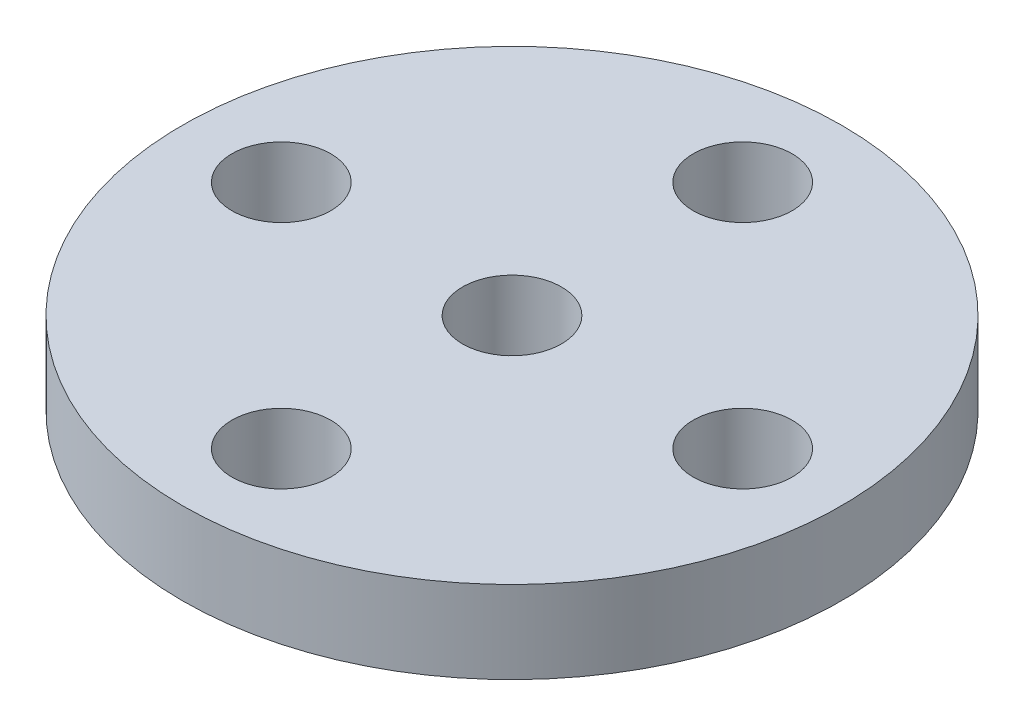
ISO-10303-21;
HEADER;
FILE_DESCRIPTION(('STEP AP214'),'2;1');
FILE_NAME('part.step','',(''),(''),'','','');
FILE_SCHEMA(('AUTOMOTIVE_DESIGN { 1 0 10303 214 1 1 1 1 }'));
ENDSEC;
DATA;
#1=APPLICATION_CONTEXT('core data for automotive mechanical design processes');
#2=APPLICATION_PROTOCOL_DEFINITION('international standard','automotive_design',2000,#1);
#3=PRODUCT_CONTEXT('',#1,'mechanical');
#4=PRODUCT('Part','Part','',(#3));
#5=PRODUCT_RELATED_PRODUCT_CATEGORY('part','',(#4));
#6=PRODUCT_DEFINITION_FORMATION('','',#4);
#7=PRODUCT_DEFINITION_CONTEXT('part definition',#1,'design');
#8=PRODUCT_DEFINITION('design','',#6,#7);
#9=PRODUCT_DEFINITION_SHAPE('','',#8);
#10=(LENGTH_UNIT() NAMED_UNIT(*) SI_UNIT(.MILLI.,.METRE.));
#11=(NAMED_UNIT(*) PLANE_ANGLE_UNIT() SI_UNIT($,.RADIAN.));
#12=(NAMED_UNIT(*) SI_UNIT($,.STERADIAN.) SOLID_ANGLE_UNIT());
#13=UNCERTAINTY_MEASURE_WITH_UNIT(LENGTH_MEASURE(1.E-05),#10,'distance_accuracy_value','');
#14=(GEOMETRIC_REPRESENTATION_CONTEXT(3) GLOBAL_UNCERTAINTY_ASSIGNED_CONTEXT((#13)) GLOBAL_UNIT_ASSIGNED_CONTEXT((#10,
#11,#12)) REPRESENTATION_CONTEXT('',''));
#15=CARTESIAN_POINT('',(0.,0.,0.));
#16=DIRECTION('',(0.,0.,1.));
#17=DIRECTION('',(1.,0.,0.));
#18=AXIS2_PLACEMENT_3D('',#15,#16,#17);
#19=CARTESIAN_POINT('',(0.,2.5,0.));
#20=DIRECTION('',(0.,1.,0.));
#21=DIRECTION('',(0.,0.,1.));
#22=AXIS2_PLACEMENT_3D('',#19,#20,#21);
#23=PLANE('',#22);
#24=CARTESIAN_POINT('',(0.,2.5,7.));
#25=DIRECTION('',(0.,1.,0.));
#26=DIRECTION('',(0.,0.,-1.));
#27=AXIS2_PLACEMENT_3D('',#24,#25,#26);
#28=CIRCLE('',#27,1.5);
#29=CARTESIAN_POINT('',(0.,2.5,5.5));
#30=VERTEX_POINT('',#29);
#31=EDGE_CURVE('E67',#30,#30,#28,.T.);
#32=ORIENTED_EDGE('',*,*,#31,.F.);
#33=EDGE_LOOP('',(#32));
#34=FACE_BOUND('',#33,.T.);
#35=CARTESIAN_POINT('',(7.,2.5,0.));
#36=DIRECTION('',(0.,1.,0.));
#37=DIRECTION('',(0.,0.,1.));
#38=AXIS2_PLACEMENT_3D('',#35,#36,#37);
#39=CIRCLE('',#38,1.5);
#40=CARTESIAN_POINT('',(7.,2.5,1.5));
#41=VERTEX_POINT('',#40);
#42=EDGE_CURVE('E55',#41,#41,#39,.T.);
#43=ORIENTED_EDGE('',*,*,#42,.F.);
#44=EDGE_LOOP('',(#43));
#45=FACE_BOUND('',#44,.T.);
#46=CARTESIAN_POINT('',(0.,2.5,0.));
#47=DIRECTION('',(0.,1.,0.));
#48=DIRECTION('',(0.,0.,1.));
#49=AXIS2_PLACEMENT_3D('',#46,#47,#48);
#50=CIRCLE('',#49,10.);
#51=CARTESIAN_POINT('',(0.,2.5,10.));
#52=VERTEX_POINT('',#51);
#53=EDGE_CURVE('E10',#52,#52,#50,.T.);
#54=ORIENTED_EDGE('',*,*,#53,.T.);
#55=EDGE_LOOP('',(#54));
#56=FACE_BOUND('',#55,.T.);
#57=CARTESIAN_POINT('',(0.,2.5,-7.));
#58=DIRECTION('',(0.,1.,0.));
#59=DIRECTION('',(0.,0.,1.));
#60=AXIS2_PLACEMENT_3D('',#57,#58,#59);
#61=CIRCLE('',#60,1.5);
#62=CARTESIAN_POINT('',(0.,2.5,-5.5));
#63=VERTEX_POINT('',#62);
#64=EDGE_CURVE('E50',#63,#63,#61,.T.);
#65=ORIENTED_EDGE('',*,*,#64,.F.);
#66=EDGE_LOOP('',(#65));
#67=FACE_BOUND('',#66,.T.);
#68=CARTESIAN_POINT('',(0.,2.5,0.));
#69=DIRECTION('',(0.,1.,0.));
#70=DIRECTION('',(0.,0.,1.));
#71=AXIS2_PLACEMENT_3D('',#68,#69,#70);
#72=CIRCLE('',#71,1.5);
#73=CARTESIAN_POINT('',(0.,2.5,1.5));
#74=VERTEX_POINT('',#73);
#75=EDGE_CURVE('E61',#74,#74,#72,.T.);
#76=ORIENTED_EDGE('',*,*,#75,.F.);
#77=EDGE_LOOP('',(#76));
#78=FACE_BOUND('',#77,.T.);
#79=CARTESIAN_POINT('',(-7.,2.5,0.));
#80=DIRECTION('',(0.,1.,0.));
#81=DIRECTION('',(0.,0.,-1.));
#82=AXIS2_PLACEMENT_3D('',#79,#80,#81);
#83=CIRCLE('',#82,1.5);
#84=CARTESIAN_POINT('',(-7.,2.5,-1.5));
#85=VERTEX_POINT('',#84);
#86=EDGE_CURVE('E73',#85,#85,#83,.T.);
#87=ORIENTED_EDGE('',*,*,#86,.F.);
#88=EDGE_LOOP('',(#87));
#89=FACE_BOUND('',#88,.T.);
#90=ADVANCED_FACE('F39',(#34,#45,#56,#67,#78,#89),#23,.T.);
#91=CARTESIAN_POINT('',(0.,0.,0.));
#92=DIRECTION('',(0.,1.,0.));
#93=DIRECTION('',(0.,0.,1.));
#94=AXIS2_PLACEMENT_3D('',#91,#92,#93);
#95=PLANE('',#94);
#96=CARTESIAN_POINT('',(0.,0.,0.));
#97=DIRECTION('',(0.,1.,0.));
#98=DIRECTION('',(0.,0.,1.));
#99=AXIS2_PLACEMENT_3D('',#96,#97,#98);
#100=CIRCLE('',#99,10.);
#101=CARTESIAN_POINT('',(0.,0.,10.));
#102=VERTEX_POINT('',#101);
#103=EDGE_CURVE('E43',#102,#102,#100,.T.);
#104=ORIENTED_EDGE('',*,*,#103,.F.);
#105=EDGE_LOOP('',(#104));
#106=FACE_BOUND('',#105,.T.);
#107=CARTESIAN_POINT('',(0.,0.,-7.));
#108=DIRECTION('',(0.,1.,0.));
#109=DIRECTION('',(0.,0.,1.));
#110=AXIS2_PLACEMENT_3D('',#107,#108,#109);
#111=CIRCLE('',#110,1.5);
#112=CARTESIAN_POINT('',(0.,0.,-5.5));
#113=VERTEX_POINT('',#112);
#114=EDGE_CURVE('E52',#113,#113,#111,.T.);
#115=ORIENTED_EDGE('',*,*,#114,.T.);
#116=EDGE_LOOP('',(#115));
#117=FACE_BOUND('',#116,.T.);
#118=CARTESIAN_POINT('',(7.,0.,0.));
#119=DIRECTION('',(0.,1.,0.));
#120=DIRECTION('',(0.,0.,1.));
#121=AXIS2_PLACEMENT_3D('',#118,#119,#120);
#122=CIRCLE('',#121,1.5);
#123=CARTESIAN_POINT('',(7.,0.,1.5));
#124=VERTEX_POINT('',#123);
#125=EDGE_CURVE('E58',#124,#124,#122,.T.);
#126=ORIENTED_EDGE('',*,*,#125,.T.);
#127=EDGE_LOOP('',(#126));
#128=FACE_BOUND('',#127,.T.);
#129=CARTESIAN_POINT('',(0.,0.,0.));
#130=DIRECTION('',(0.,1.,0.));
#131=DIRECTION('',(0.,0.,1.));
#132=AXIS2_PLACEMENT_3D('',#129,#130,#131);
#133=CIRCLE('',#132,1.5);
#134=CARTESIAN_POINT('',(0.,0.,1.5));
#135=VERTEX_POINT('',#134);
#136=EDGE_CURVE('E64',#135,#135,#133,.T.);
#137=ORIENTED_EDGE('',*,*,#136,.T.);
#138=EDGE_LOOP('',(#137));
#139=FACE_BOUND('',#138,.T.);
#140=CARTESIAN_POINT('',(0.,0.,7.));
#141=DIRECTION('',(0.,1.,0.));
#142=DIRECTION('',(0.,0.,-1.));
#143=AXIS2_PLACEMENT_3D('',#140,#141,#142);
#144=CIRCLE('',#143,1.5);
#145=CARTESIAN_POINT('',(0.,0.,5.5));
#146=VERTEX_POINT('',#145);
#147=EDGE_CURVE('E70',#146,#146,#144,.T.);
#148=ORIENTED_EDGE('',*,*,#147,.T.);
#149=EDGE_LOOP('',(#148));
#150=FACE_BOUND('',#149,.T.);
#151=CARTESIAN_POINT('',(-7.,0.,0.));
#152=DIRECTION('',(0.,1.,0.));
#153=DIRECTION('',(0.,0.,-1.));
#154=AXIS2_PLACEMENT_3D('',#151,#152,#153);
#155=CIRCLE('',#154,1.5);
#156=CARTESIAN_POINT('',(-7.,0.,-1.5));
#157=VERTEX_POINT('',#156);
#158=EDGE_CURVE('E76',#157,#157,#155,.T.);
#159=ORIENTED_EDGE('',*,*,#158,.T.);
#160=EDGE_LOOP('',(#159));
#161=FACE_BOUND('',#160,.T.);
#162=ADVANCED_FACE('F86',(#106,#117,#128,#139,#150,#161),#95,.F.);
#163=CARTESIAN_POINT('',(0.,2.5,0.));
#164=DIRECTION('',(0.,-1.,0.));
#165=DIRECTION('',(0.,0.,-1.));
#166=AXIS2_PLACEMENT_3D('',#163,#164,#165);
#167=CYLINDRICAL_SURFACE('',#166,10.);
#168=ORIENTED_EDGE('',*,*,#53,.F.);
#169=EDGE_LOOP('',(#168));
#170=FACE_BOUND('',#169,.T.);
#171=ORIENTED_EDGE('',*,*,#103,.T.);
#172=EDGE_LOOP('',(#171));
#173=FACE_BOUND('',#172,.T.);
#174=ADVANCED_FACE('F41',(#170,#173),#167,.T.);
#175=CARTESIAN_POINT('',(0.,2.5,-7.));
#176=DIRECTION('',(0.,-1.,0.));
#177=DIRECTION('',(0.,0.,-1.));
#178=AXIS2_PLACEMENT_3D('',#175,#176,#177);
#179=CYLINDRICAL_SURFACE('',#178,1.5);
#180=ORIENTED_EDGE('',*,*,#64,.T.);
#181=EDGE_LOOP('',(#180));
#182=FACE_BOUND('',#181,.T.);
#183=ORIENTED_EDGE('',*,*,#114,.F.);
#184=EDGE_LOOP('',(#183));
#185=FACE_BOUND('',#184,.T.);
#186=ADVANCED_FACE('F96',(#182,#185),#179,.F.);
#187=CARTESIAN_POINT('',(7.,2.5,0.));
#188=DIRECTION('',(0.,-1.,0.));
#189=DIRECTION('',(0.,0.,-1.));
#190=AXIS2_PLACEMENT_3D('',#187,#188,#189);
#191=CYLINDRICAL_SURFACE('',#190,1.5);
#192=ORIENTED_EDGE('',*,*,#42,.T.);
#193=EDGE_LOOP('',(#192));
#194=FACE_BOUND('',#193,.T.);
#195=ORIENTED_EDGE('',*,*,#125,.F.);
#196=EDGE_LOOP('',(#195));
#197=FACE_BOUND('',#196,.T.);
#198=ADVANCED_FACE('F99',(#194,#197),#191,.F.);
#199=CARTESIAN_POINT('',(0.,2.5,0.));
#200=DIRECTION('',(0.,-1.,0.));
#201=DIRECTION('',(0.,0.,-1.));
#202=AXIS2_PLACEMENT_3D('',#199,#200,#201);
#203=CYLINDRICAL_SURFACE('',#202,1.5);
#204=ORIENTED_EDGE('',*,*,#75,.T.);
#205=EDGE_LOOP('',(#204));
#206=FACE_BOUND('',#205,.T.);
#207=ORIENTED_EDGE('',*,*,#136,.F.);
#208=EDGE_LOOP('',(#207));
#209=FACE_BOUND('',#208,.T.);
#210=ADVANCED_FACE('F103',(#206,#209),#203,.F.);
#211=CARTESIAN_POINT('',(0.,2.5,7.));
#212=DIRECTION('',(0.,-1.,0.));
#213=DIRECTION('',(0.,0.,-1.));
#214=AXIS2_PLACEMENT_3D('',#211,#212,#213);
#215=CYLINDRICAL_SURFACE('',#214,1.5);
#216=ORIENTED_EDGE('',*,*,#31,.T.);
#217=EDGE_LOOP('',(#216));
#218=FACE_BOUND('',#217,.T.);
#219=ORIENTED_EDGE('',*,*,#147,.F.);
#220=EDGE_LOOP('',(#219));
#221=FACE_BOUND('',#220,.T.);
#222=ADVANCED_FACE('F107',(#218,#221),#215,.F.);
#223=CARTESIAN_POINT('',(-7.,2.5,0.));
#224=DIRECTION('',(0.,-1.,0.));
#225=DIRECTION('',(0.,0.,-1.));
#226=AXIS2_PLACEMENT_3D('',#223,#224,#225);
#227=CYLINDRICAL_SURFACE('',#226,1.5);
#228=ORIENTED_EDGE('',*,*,#86,.T.);
#229=EDGE_LOOP('',(#228));
#230=FACE_BOUND('',#229,.T.);
#231=ORIENTED_EDGE('',*,*,#158,.F.);
#232=EDGE_LOOP('',(#231));
#233=FACE_BOUND('',#232,.T.);
#234=ADVANCED_FACE('F82',(#230,#233),#227,.F.);
#235=CLOSED_SHELL('',(#90,#162,#174,#186,#198,#210,#222,#234));
#236=MANIFOLD_SOLID_BREP('B2',#235);
#237=ADVANCED_BREP_SHAPE_REPRESENTATION('',(#18,#236),#14);
#238=SHAPE_DEFINITION_REPRESENTATION(#9,#237);
ENDSEC;
END-ISO-10303-21;
